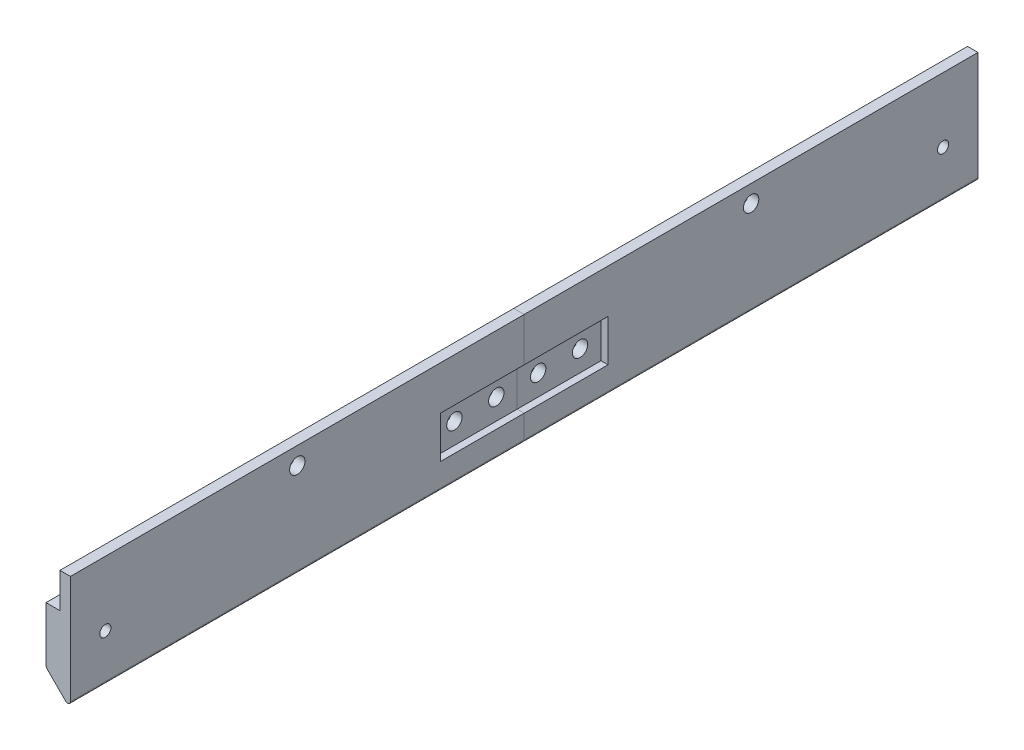
ISO-10303-21;
HEADER;
FILE_DESCRIPTION(('STEP AP214'),'2;1');
FILE_NAME('part.step','',(''),(''),'','','');
FILE_SCHEMA(('AUTOMOTIVE_DESIGN { 1 0 10303 214 1 1 1 1 }'));
ENDSEC;
DATA;
#1=APPLICATION_CONTEXT('core data for automotive mechanical design processes');
#2=APPLICATION_PROTOCOL_DEFINITION('international standard','automotive_design',2000,#1);
#3=PRODUCT_CONTEXT('',#1,'mechanical');
#4=PRODUCT('Part','Part','',(#3));
#5=PRODUCT_RELATED_PRODUCT_CATEGORY('part','',(#4));
#6=PRODUCT_DEFINITION_FORMATION('','',#4);
#7=PRODUCT_DEFINITION_CONTEXT('part definition',#1,'design');
#8=PRODUCT_DEFINITION('design','',#6,#7);
#9=PRODUCT_DEFINITION_SHAPE('','',#8);
#10=(LENGTH_UNIT() NAMED_UNIT(*) SI_UNIT(.MILLI.,.METRE.));
#11=(NAMED_UNIT(*) PLANE_ANGLE_UNIT() SI_UNIT($,.RADIAN.));
#12=(NAMED_UNIT(*) SI_UNIT($,.STERADIAN.) SOLID_ANGLE_UNIT());
#13=UNCERTAINTY_MEASURE_WITH_UNIT(LENGTH_MEASURE(1.E-05),#10,'distance_accuracy_value','');
#14=(GEOMETRIC_REPRESENTATION_CONTEXT(3) GLOBAL_UNCERTAINTY_ASSIGNED_CONTEXT((#13)) GLOBAL_UNIT_ASSIGNED_CONTEXT((#10,
#11,#12)) REPRESENTATION_CONTEXT('',''));
#15=CARTESIAN_POINT('',(0.,0.,0.));
#16=DIRECTION('',(0.,0.,1.));
#17=DIRECTION('',(1.,0.,0.));
#18=AXIS2_PLACEMENT_3D('',#15,#16,#17);
#19=CARTESIAN_POINT('',(-7.01000000000001,30.,150.));
#20=DIRECTION('',(0.,0.,1.));
#21=DIRECTION('',(1.,0.,0.));
#22=AXIS2_PLACEMENT_3D('',#19,#20,#21);
#23=PLANE('',#22);
#24=DIRECTION('',(1.,0.,0.));
#25=VECTOR('',#24,1.);
#26=CARTESIAN_POINT('',(-7.01,5.5,150.));
#27=LINE('',#26,#25);
#28=CARTESIAN_POINT('',(-2.,5.5,150.));
#29=VERTEX_POINT('',#28);
#30=CARTESIAN_POINT('',(0.,5.5,150.));
#31=VERTEX_POINT('',#30);
#32=EDGE_CURVE('E175',#29,#31,#27,.T.);
#33=ORIENTED_EDGE('',*,*,#32,.F.);
#34=DIRECTION('',(0.,1.,0.));
#35=VECTOR('',#34,1.);
#36=CARTESIAN_POINT('',(-2.00000000000001,30.,150.));
#37=LINE('',#36,#35);
#38=CARTESIAN_POINT('',(-2.,17.5,150.));
#39=VERTEX_POINT('',#38);
#40=EDGE_CURVE('E12',#29,#39,#37,.T.);
#41=ORIENTED_EDGE('',*,*,#40,.T.);
#42=DIRECTION('',(-1.,0.,0.));
#43=VECTOR('',#42,1.);
#44=CARTESIAN_POINT('',(-7.01,17.5,150.));
#45=LINE('',#44,#43);
#46=CARTESIAN_POINT('',(0.,17.5,150.));
#47=VERTEX_POINT('',#46);
#48=EDGE_CURVE('E158',#47,#39,#45,.T.);
#49=ORIENTED_EDGE('',*,*,#48,.F.);
#50=DIRECTION('',(0.,-1.,0.));
#51=VECTOR('',#50,1.);
#52=CARTESIAN_POINT('',(0.,0.,150.));
#53=LINE('',#52,#51);
#54=CARTESIAN_POINT('',(0.,30.,150.));
#55=VERTEX_POINT('',#54);
#56=EDGE_CURVE('E227',#55,#47,#53,.T.);
#57=ORIENTED_EDGE('',*,*,#56,.F.);
#58=DIRECTION('',(1.,0.,0.));
#59=VECTOR('',#58,1.);
#60=CARTESIAN_POINT('',(0.,30.,150.));
#61=LINE('',#60,#59);
#62=CARTESIAN_POINT('',(-3.,30.,150.));
#63=VERTEX_POINT('',#62);
#64=EDGE_CURVE('E218',#63,#55,#61,.T.);
#65=ORIENTED_EDGE('',*,*,#64,.F.);
#66=DIRECTION('',(0.,1.,0.));
#67=VECTOR('',#66,1.);
#68=CARTESIAN_POINT('',(-3.,20.,150.));
#69=LINE('',#68,#67);
#70=CARTESIAN_POINT('',(-3.,20.,150.));
#71=VERTEX_POINT('',#70);
#72=EDGE_CURVE('E234',#71,#63,#69,.T.);
#73=ORIENTED_EDGE('',*,*,#72,.F.);
#74=DIRECTION('',(-1.,0.,0.));
#75=VECTOR('',#74,1.);
#76=CARTESIAN_POINT('',(-7.,20.,150.));
#77=LINE('',#76,#75);
#78=CARTESIAN_POINT('',(-7.,20.,150.));
#79=VERTEX_POINT('',#78);
#80=EDGE_CURVE('E237',#71,#79,#77,.T.);
#81=ORIENTED_EDGE('',*,*,#80,.T.);
#82=DIRECTION('',(0.,1.,0.));
#83=VECTOR('',#82,1.);
#84=CARTESIAN_POINT('',(-7.,7.,150.));
#85=LINE('',#84,#83);
#86=CARTESIAN_POINT('',(-7.,4.62132034355964,150.));
#87=VERTEX_POINT('',#86);
#88=EDGE_CURVE('E231',#87,#79,#85,.T.);
#89=ORIENTED_EDGE('',*,*,#88,.F.);
#90=CARTESIAN_POINT('',(-5.5,4.62132034355964,150.));
#91=DIRECTION('',(0.,0.,1.));
#92=DIRECTION('',(1.,0.,0.));
#93=AXIS2_PLACEMENT_3D('',#90,#91,#92);
#94=CIRCLE('',#93,1.5);
#95=CARTESIAN_POINT('',(-6.56066017177982,3.56066017177982,150.));
#96=VERTEX_POINT('',#95);
#97=EDGE_CURVE('E222',#96,#87,#94,.F.);
#98=ORIENTED_EDGE('',*,*,#97,.F.);
#99=DIRECTION('',(-0.707106781186548,0.707106781186548,0.));
#100=VECTOR('',#99,1.);
#101=CARTESIAN_POINT('',(-7.,4.,150.));
#102=LINE('',#101,#100);
#103=CARTESIAN_POINT('',(-1.36568542494924,-1.63431457505076,150.));
#104=VERTEX_POINT('',#103);
#105=EDGE_CURVE('E224',#104,#96,#102,.T.);
#106=ORIENTED_EDGE('',*,*,#105,.F.);
#107=CARTESIAN_POINT('',(-0.8,-1.06862915010153,150.));
#108=DIRECTION('',(0.,0.,1.));
#109=DIRECTION('',(1.,0.,0.));
#110=AXIS2_PLACEMENT_3D('',#107,#108,#109);
#111=CIRCLE('',#110,0.8);
#112=CARTESIAN_POINT('',(0.,-1.06862915010152,150.));
#113=VERTEX_POINT('',#112);
#114=EDGE_CURVE('E220',#113,#104,#111,.F.);
#115=ORIENTED_EDGE('',*,*,#114,.F.);
#116=EDGE_CURVE('E230',#31,#113,#53,.T.);
#117=ORIENTED_EDGE('',*,*,#116,.F.);
#118=EDGE_LOOP('',(#33,#41,#49,#57,#65,#73,#81,#89,#98,#106,#115,#117));
#119=FACE_BOUND('',#118,.T.);
#120=ADVANCED_FACE('F55',(#119),#23,.T.);
#121=CARTESIAN_POINT('',(-3.,20.,20.));
#122=DIRECTION('',(-1.,0.,0.));
#123=DIRECTION('',(0.,0.,1.));
#124=AXIS2_PLACEMENT_3D('',#121,#122,#123);
#125=PLANE('',#124);
#126=CARTESIAN_POINT('',(-3.,25.,85.));
#127=DIRECTION('',(-1.,0.,0.));
#128=DIRECTION('',(0.,0.,1.));
#129=AXIS2_PLACEMENT_3D('',#126,#127,#128);
#130=CIRCLE('',#129,2.2);
#131=CARTESIAN_POINT('',(-3.,25.,87.2));
#132=VERTEX_POINT('',#131);
#133=EDGE_CURVE('E177',#132,#132,#130,.T.);
#134=ORIENTED_EDGE('',*,*,#133,.F.);
#135=EDGE_LOOP('',(#134));
#136=FACE_BOUND('',#135,.T.);
#137=DIRECTION('',(0.,0.,-1.));
#138=VECTOR('',#137,1.);
#139=CARTESIAN_POINT('',(-3.,20.,280.));
#140=LINE('',#139,#138);
#141=CARTESIAN_POINT('',(-3.,20.,20.));
#142=VERTEX_POINT('',#141);
#143=EDGE_CURVE('E79',#71,#142,#140,.T.);
#144=ORIENTED_EDGE('',*,*,#143,.F.);
#145=ORIENTED_EDGE('',*,*,#72,.T.);
#146=DIRECTION('',(0.,0.,1.));
#147=VECTOR('',#146,1.);
#148=CARTESIAN_POINT('',(-3.,30.,20.));
#149=LINE('',#148,#147);
#150=CARTESIAN_POINT('',(-3.,30.,20.));
#151=VERTEX_POINT('',#150);
#152=EDGE_CURVE('E208',#151,#63,#149,.T.);
#153=ORIENTED_EDGE('',*,*,#152,.F.);
#154=DIRECTION('',(0.,-1.,0.));
#155=VECTOR('',#154,1.);
#156=CARTESIAN_POINT('',(-3.,20.,20.));
#157=LINE('',#156,#155);
#158=EDGE_CURVE('E188',#151,#142,#157,.T.);
#159=ORIENTED_EDGE('',*,*,#158,.T.);
#160=EDGE_LOOP('',(#144,#145,#153,#159));
#161=FACE_BOUND('',#160,.T.);
#162=ADVANCED_FACE('F280',(#136,#161),#125,.T.);
#163=CARTESIAN_POINT('',(-7.,7.,20.));
#164=DIRECTION('',(-1.,0.,0.));
#165=DIRECTION('',(0.,0.,1.));
#166=AXIS2_PLACEMENT_3D('',#163,#164,#165);
#167=PLANE('',#166);
#168=CARTESIAN_POINT('',(-7.,11.5,30.));
#169=DIRECTION('',(-1.,0.,0.));
#170=DIRECTION('',(0.,0.,1.));
#171=AXIS2_PLACEMENT_3D('',#168,#169,#170);
#172=CIRCLE('',#171,3.36);
#173=CARTESIAN_POINT('',(-7.,11.5,33.36));
#174=VERTEX_POINT('',#173);
#175=EDGE_CURVE('E215',#174,#174,#172,.T.);
#176=ORIENTED_EDGE('',*,*,#175,.F.);
#177=EDGE_LOOP('',(#176));
#178=FACE_BOUND('',#177,.T.);
#179=DIRECTION('',(0.,0.,1.));
#180=VECTOR('',#179,1.);
#181=CARTESIAN_POINT('',(-7.,4.62132034355964,20.));
#182=LINE('',#181,#180);
#183=CARTESIAN_POINT('',(-7.,4.62132034355964,20.));
#184=VERTEX_POINT('',#183);
#185=EDGE_CURVE('E192',#184,#87,#182,.T.);
#186=ORIENTED_EDGE('',*,*,#185,.T.);
#187=ORIENTED_EDGE('',*,*,#88,.T.);
#188=DIRECTION('',(0.,0.,-1.));
#189=VECTOR('',#188,1.);
#190=CARTESIAN_POINT('',(-7.,20.,280.));
#191=LINE('',#190,#189);
#192=CARTESIAN_POINT('',(-7.,20.,20.));
#193=VERTEX_POINT('',#192);
#194=EDGE_CURVE('E207',#79,#193,#191,.T.);
#195=ORIENTED_EDGE('',*,*,#194,.T.);
#196=DIRECTION('',(0.,-1.,0.));
#197=VECTOR('',#196,1.);
#198=CARTESIAN_POINT('',(-7.,7.,20.));
#199=LINE('',#198,#197);
#200=EDGE_CURVE('E198',#193,#184,#199,.T.);
#201=ORIENTED_EDGE('',*,*,#200,.T.);
#202=EDGE_LOOP('',(#186,#187,#195,#201));
#203=FACE_BOUND('',#202,.T.);
#204=ADVANCED_FACE('F285',(#178,#203),#167,.T.);
#205=CARTESIAN_POINT('',(0.,0.,20.));
#206=DIRECTION('',(1.,0.,0.));
#207=DIRECTION('',(0.,1.,0.));
#208=AXIS2_PLACEMENT_3D('',#205,#206,#207);
#209=PLANE('',#208);
#210=DIRECTION('',(0.,0.,-1.));
#211=VECTOR('',#210,1.);
#212=CARTESIAN_POINT('',(0.,5.5,20.));
#213=LINE('',#212,#211);
#214=CARTESIAN_POINT('',(0.,5.5,126.));
#215=VERTEX_POINT('',#214);
#216=EDGE_CURVE('E63',#31,#215,#213,.T.);
#217=ORIENTED_EDGE('',*,*,#216,.F.);
#218=ORIENTED_EDGE('',*,*,#116,.T.);
#219=DIRECTION('',(0.,0.,-1.));
#220=VECTOR('',#219,1.);
#221=CARTESIAN_POINT('',(0.,-1.06862915010152,20.));
#222=LINE('',#221,#220);
#223=CARTESIAN_POINT('',(0.,-1.06862915010152,20.));
#224=VERTEX_POINT('',#223);
#225=EDGE_CURVE('E183',#113,#224,#222,.T.);
#226=ORIENTED_EDGE('',*,*,#225,.T.);
#227=DIRECTION('',(0.,1.,0.));
#228=VECTOR('',#227,1.);
#229=CARTESIAN_POINT('',(0.,0.,20.));
#230=LINE('',#229,#228);
#231=CARTESIAN_POINT('',(0.,30.,20.));
#232=VERTEX_POINT('',#231);
#233=EDGE_CURVE('E191',#224,#232,#230,.T.);
#234=ORIENTED_EDGE('',*,*,#233,.T.);
#235=DIRECTION('',(0.,0.,-1.));
#236=VECTOR('',#235,1.);
#237=CARTESIAN_POINT('',(0.,30.,280.));
#238=LINE('',#237,#236);
#239=EDGE_CURVE('E204',#55,#232,#238,.T.);
#240=ORIENTED_EDGE('',*,*,#239,.F.);
#241=ORIENTED_EDGE('',*,*,#56,.T.);
#242=DIRECTION('',(0.,0.,1.));
#243=VECTOR('',#242,1.);
#244=CARTESIAN_POINT('',(0.,17.5,174.));
#245=LINE('',#244,#243);
#246=CARTESIAN_POINT('',(0.,17.5,126.));
#247=VERTEX_POINT('',#246);
#248=EDGE_CURVE('E164',#247,#47,#245,.T.);
#249=ORIENTED_EDGE('',*,*,#248,.F.);
#250=DIRECTION('',(0.,1.,0.));
#251=VECTOR('',#250,1.);
#252=CARTESIAN_POINT('',(0.,17.5,126.));
#253=LINE('',#252,#251);
#254=EDGE_CURVE('E70',#215,#247,#253,.T.);
#255=ORIENTED_EDGE('',*,*,#254,.F.);
#256=EDGE_LOOP('',(#217,#218,#226,#234,#240,#241,#249,#255));
#257=FACE_BOUND('',#256,.T.);
#258=CARTESIAN_POINT('',(0.,25.,85.));
#259=DIRECTION('',(1.,0.,0.));
#260=DIRECTION('',(0.,1.,0.));
#261=AXIS2_PLACEMENT_3D('',#258,#259,#260);
#262=CIRCLE('',#261,2.2);
#263=CARTESIAN_POINT('',(0.,27.2,85.));
#264=VERTEX_POINT('',#263);
#265=EDGE_CURVE('E180',#264,#264,#262,.T.);
#266=ORIENTED_EDGE('',*,*,#265,.F.);
#267=EDGE_LOOP('',(#266));
#268=FACE_BOUND('',#267,.T.);
#269=CARTESIAN_POINT('',(0.,11.5,30.));
#270=DIRECTION('',(-1.,0.,0.));
#271=DIRECTION('',(0.,0.,1.));
#272=AXIS2_PLACEMENT_3D('',#269,#270,#271);
#273=CIRCLE('',#272,1.59999999999999);
#274=CARTESIAN_POINT('',(0.,11.5,31.6));
#275=VERTEX_POINT('',#274);
#276=EDGE_CURVE('E209',#275,#275,#273,.T.);
#277=ORIENTED_EDGE('',*,*,#276,.T.);
#278=EDGE_LOOP('',(#277));
#279=FACE_BOUND('',#278,.T.);
#280=ADVANCED_FACE('F258',(#257,#268,#279),#209,.T.);
#281=CARTESIAN_POINT('',(-7.,4.,20.));
#282=DIRECTION('',(-0.707106781186548,-0.707106781186548,0.));
#283=DIRECTION('',(0.707106781186548,-0.707106781186548,0.));
#284=AXIS2_PLACEMENT_3D('',#281,#282,#283);
#285=PLANE('',#284);
#286=DIRECTION('',(0.,0.,-1.));
#287=VECTOR('',#286,1.);
#288=CARTESIAN_POINT('',(-1.36568542494924,-1.63431457505076,20.));
#289=LINE('',#288,#287);
#290=CARTESIAN_POINT('',(-1.36568542494924,-1.63431457505076,20.));
#291=VERTEX_POINT('',#290);
#292=EDGE_CURVE('E184',#291,#104,#289,.F.);
#293=ORIENTED_EDGE('',*,*,#292,.T.);
#294=ORIENTED_EDGE('',*,*,#105,.T.);
#295=DIRECTION('',(0.,0.,1.));
#296=VECTOR('',#295,1.);
#297=CARTESIAN_POINT('',(-6.56066017177982,3.56066017177982,20.));
#298=LINE('',#297,#296);
#299=CARTESIAN_POINT('',(-6.56066017177982,3.56066017177982,20.));
#300=VERTEX_POINT('',#299);
#301=EDGE_CURVE('E187',#96,#300,#298,.F.);
#302=ORIENTED_EDGE('',*,*,#301,.T.);
#303=DIRECTION('',(0.707106781186548,-0.707106781186548,0.));
#304=VECTOR('',#303,1.);
#305=CARTESIAN_POINT('',(-7.,4.,20.));
#306=LINE('',#305,#304);
#307=EDGE_CURVE('E195',#300,#291,#306,.T.);
#308=ORIENTED_EDGE('',*,*,#307,.T.);
#309=EDGE_LOOP('',(#293,#294,#302,#308));
#310=FACE_BOUND('',#309,.T.);
#311=ADVANCED_FACE('F290',(#310),#285,.T.);
#312=CARTESIAN_POINT('',(-5.5,4.62132034355964,20.));
#313=DIRECTION('',(0.,0.,1.));
#314=DIRECTION('',(1.,0.,0.));
#315=AXIS2_PLACEMENT_3D('',#312,#313,#314);
#316=CYLINDRICAL_SURFACE('',#315,1.5);
#317=ORIENTED_EDGE('',*,*,#301,.F.);
#318=ORIENTED_EDGE('',*,*,#97,.T.);
#319=ORIENTED_EDGE('',*,*,#185,.F.);
#320=CARTESIAN_POINT('',(-5.5,4.62132034355964,20.));
#321=DIRECTION('',(0.,0.,1.));
#322=DIRECTION('',(1.,0.,0.));
#323=AXIS2_PLACEMENT_3D('',#320,#321,#322);
#324=CIRCLE('',#323,1.5);
#325=EDGE_CURVE('E185',#300,#184,#324,.F.);
#326=ORIENTED_EDGE('',*,*,#325,.F.);
#327=EDGE_LOOP('',(#317,#318,#319,#326));
#328=FACE_BOUND('',#327,.T.);
#329=ADVANCED_FACE('F57',(#328),#316,.T.);
#330=CARTESIAN_POINT('',(-0.8,-1.06862915010153,20.));
#331=DIRECTION('',(0.,0.,-1.));
#332=DIRECTION('',(-1.,0.,0.));
#333=AXIS2_PLACEMENT_3D('',#330,#331,#332);
#334=CYLINDRICAL_SURFACE('',#333,0.8);
#335=ORIENTED_EDGE('',*,*,#225,.F.);
#336=ORIENTED_EDGE('',*,*,#114,.T.);
#337=ORIENTED_EDGE('',*,*,#292,.F.);
#338=CARTESIAN_POINT('',(-0.8,-1.06862915010153,20.));
#339=DIRECTION('',(0.,0.,1.));
#340=DIRECTION('',(1.,0.,0.));
#341=AXIS2_PLACEMENT_3D('',#338,#339,#340);
#342=CIRCLE('',#341,0.8);
#343=EDGE_CURVE('E181',#224,#291,#342,.F.);
#344=ORIENTED_EDGE('',*,*,#343,.F.);
#345=EDGE_LOOP('',(#335,#336,#337,#344));
#346=FACE_BOUND('',#345,.T.);
#347=ADVANCED_FACE('F271',(#346),#334,.T.);
#348=CARTESIAN_POINT('',(0.,30.,0.));
#349=DIRECTION('',(0.,1.,0.));
#350=DIRECTION('',(0.,0.,1.));
#351=AXIS2_PLACEMENT_3D('',#348,#349,#350);
#352=PLANE('',#351);
#353=ORIENTED_EDGE('',*,*,#152,.T.);
#354=ORIENTED_EDGE('',*,*,#64,.T.);
#355=ORIENTED_EDGE('',*,*,#239,.T.);
#356=DIRECTION('',(-1.,0.,0.));
#357=VECTOR('',#356,1.);
#358=CARTESIAN_POINT('',(0.,30.,20.));
#359=LINE('',#358,#357);
#360=EDGE_CURVE('E201',#232,#151,#359,.T.);
#361=ORIENTED_EDGE('',*,*,#360,.T.);
#362=EDGE_LOOP('',(#353,#354,#355,#361));
#363=FACE_BOUND('',#362,.T.);
#364=ADVANCED_FACE('F278',(#363),#352,.T.);
#365=CARTESIAN_POINT('',(-7.,20.,280.));
#366=DIRECTION('',(0.,-1.,0.));
#367=DIRECTION('',(0.,0.,-1.));
#368=AXIS2_PLACEMENT_3D('',#365,#366,#367);
#369=PLANE('',#368);
#370=ORIENTED_EDGE('',*,*,#80,.F.);
#371=ORIENTED_EDGE('',*,*,#143,.T.);
#372=DIRECTION('',(1.,0.,0.));
#373=VECTOR('',#372,1.);
#374=CARTESIAN_POINT('',(-7.,20.,20.));
#375=LINE('',#374,#373);
#376=EDGE_CURVE('E205',#193,#142,#375,.T.);
#377=ORIENTED_EDGE('',*,*,#376,.F.);
#378=ORIENTED_EDGE('',*,*,#194,.F.);
#379=EDGE_LOOP('',(#370,#371,#377,#378));
#380=FACE_BOUND('',#379,.T.);
#381=ADVANCED_FACE('F283',(#380),#369,.F.);
#382=CARTESIAN_POINT('',(0.,0.,20.));
#383=DIRECTION('',(0.,0.,1.));
#384=DIRECTION('',(1.,0.,0.));
#385=AXIS2_PLACEMENT_3D('',#382,#383,#384);
#386=PLANE('',#385);
#387=ORIENTED_EDGE('',*,*,#200,.F.);
#388=ORIENTED_EDGE('',*,*,#376,.T.);
#389=ORIENTED_EDGE('',*,*,#158,.F.);
#390=ORIENTED_EDGE('',*,*,#360,.F.);
#391=ORIENTED_EDGE('',*,*,#233,.F.);
#392=ORIENTED_EDGE('',*,*,#343,.T.);
#393=ORIENTED_EDGE('',*,*,#307,.F.);
#394=ORIENTED_EDGE('',*,*,#325,.T.);
#395=EDGE_LOOP('',(#387,#388,#389,#390,#391,#392,#393,#394));
#396=FACE_BOUND('',#395,.T.);
#397=ADVANCED_FACE('F275',(#396),#386,.F.);
#398=CARTESIAN_POINT('',(-7.,11.5,30.));
#399=DIRECTION('',(-1.,0.,0.));
#400=DIRECTION('',(0.,0.,1.));
#401=AXIS2_PLACEMENT_3D('',#398,#399,#400);
#402=CYLINDRICAL_SURFACE('',#401,1.59999999999999);
#403=ORIENTED_EDGE('',*,*,#276,.F.);
#404=EDGE_LOOP('',(#403));
#405=FACE_BOUND('',#404,.T.);
#406=CARTESIAN_POINT('',(-5.23999999999999,11.5,30.));
#407=DIRECTION('',(-1.,0.,0.));
#408=DIRECTION('',(0.,0.,1.));
#409=AXIS2_PLACEMENT_3D('',#406,#407,#408);
#410=CIRCLE('',#409,1.59999999999999);
#411=CARTESIAN_POINT('',(-5.23999999999999,11.5,31.6));
#412=VERTEX_POINT('',#411);
#413=EDGE_CURVE('E212',#412,#412,#410,.T.);
#414=ORIENTED_EDGE('',*,*,#413,.T.);
#415=EDGE_LOOP('',(#414));
#416=FACE_BOUND('',#415,.T.);
#417=ADVANCED_FACE('F333',(#405,#416),#402,.F.);
#418=CARTESIAN_POINT('',(-7.,11.5,30.));
#419=DIRECTION('',(-1.,0.,0.));
#420=DIRECTION('',(0.,0.,1.));
#421=AXIS2_PLACEMENT_3D('',#418,#419,#420);
#422=CONICAL_SURFACE('',#421,3.36,0.785398163397448);
#423=ORIENTED_EDGE('',*,*,#413,.F.);
#424=EDGE_LOOP('',(#423));
#425=FACE_BOUND('',#424,.T.);
#426=ORIENTED_EDGE('',*,*,#175,.T.);
#427=EDGE_LOOP('',(#426));
#428=FACE_BOUND('',#427,.T.);
#429=ADVANCED_FACE('F309',(#425,#428),#422,.F.);
#430=CARTESIAN_POINT('',(-3.,25.,85.));
#431=DIRECTION('',(-1.,0.,0.));
#432=DIRECTION('',(0.,0.,1.));
#433=AXIS2_PLACEMENT_3D('',#430,#431,#432);
#434=CYLINDRICAL_SURFACE('',#433,2.2);
#435=ORIENTED_EDGE('',*,*,#265,.T.);
#436=EDGE_LOOP('',(#435));
#437=FACE_BOUND('',#436,.T.);
#438=ORIENTED_EDGE('',*,*,#133,.T.);
#439=EDGE_LOOP('',(#438));
#440=FACE_BOUND('',#439,.T.);
#441=ADVANCED_FACE('F308',(#437,#440),#434,.F.);
#442=CARTESIAN_POINT('',(-2.,17.5,126.));
#443=DIRECTION('',(0.,0.,-1.));
#444=DIRECTION('',(-1.,0.,0.));
#445=AXIS2_PLACEMENT_3D('',#442,#443,#444);
#446=PLANE('',#445);
#447=ORIENTED_EDGE('',*,*,#254,.T.);
#448=DIRECTION('',(1.,0.,0.));
#449=VECTOR('',#448,1.);
#450=CARTESIAN_POINT('',(-2.,17.5,126.));
#451=LINE('',#450,#449);
#452=CARTESIAN_POINT('',(-2.,17.5,126.));
#453=VERTEX_POINT('',#452);
#454=EDGE_CURVE('E144',#453,#247,#451,.T.);
#455=ORIENTED_EDGE('',*,*,#454,.F.);
#456=DIRECTION('',(0.,1.,0.));
#457=VECTOR('',#456,1.);
#458=CARTESIAN_POINT('',(-2.,17.5,126.));
#459=LINE('',#458,#457);
#460=CARTESIAN_POINT('',(-2.,5.5,126.));
#461=VERTEX_POINT('',#460);
#462=EDGE_CURVE('E148',#461,#453,#459,.T.);
#463=ORIENTED_EDGE('',*,*,#462,.F.);
#464=DIRECTION('',(1.,0.,0.));
#465=VECTOR('',#464,1.);
#466=CARTESIAN_POINT('',(-2.,5.5,126.));
#467=LINE('',#466,#465);
#468=EDGE_CURVE('E151',#461,#215,#467,.T.);
#469=ORIENTED_EDGE('',*,*,#468,.T.);
#470=EDGE_LOOP('',(#447,#455,#463,#469));
#471=FACE_BOUND('',#470,.T.);
#472=ADVANCED_FACE('F146',(#471),#446,.F.);
#473=CARTESIAN_POINT('',(-2.,5.5,174.));
#474=DIRECTION('',(0.,-1.,0.));
#475=DIRECTION('',(1.,0.,0.));
#476=AXIS2_PLACEMENT_3D('',#473,#474,#475);
#477=PLANE('',#476);
#478=ORIENTED_EDGE('',*,*,#32,.T.);
#479=ORIENTED_EDGE('',*,*,#216,.T.);
#480=ORIENTED_EDGE('',*,*,#468,.F.);
#481=DIRECTION('',(0.,0.,-1.));
#482=VECTOR('',#481,1.);
#483=CARTESIAN_POINT('',(-2.,5.5,174.));
#484=LINE('',#483,#482);
#485=EDGE_CURVE('E152',#29,#461,#484,.T.);
#486=ORIENTED_EDGE('',*,*,#485,.F.);
#487=EDGE_LOOP('',(#478,#479,#480,#486));
#488=FACE_BOUND('',#487,.T.);
#489=ADVANCED_FACE('F254',(#488),#477,.F.);
#490=CARTESIAN_POINT('',(-2.,17.5,174.));
#491=DIRECTION('',(0.,1.,0.));
#492=DIRECTION('',(-1.,0.,0.));
#493=AXIS2_PLACEMENT_3D('',#490,#491,#492);
#494=PLANE('',#493);
#495=ORIENTED_EDGE('',*,*,#48,.T.);
#496=DIRECTION('',(0.,0.,1.));
#497=VECTOR('',#496,1.);
#498=CARTESIAN_POINT('',(-2.,17.5,174.));
#499=LINE('',#498,#497);
#500=EDGE_CURVE('E155',#453,#39,#499,.T.);
#501=ORIENTED_EDGE('',*,*,#500,.F.);
#502=ORIENTED_EDGE('',*,*,#454,.T.);
#503=ORIENTED_EDGE('',*,*,#248,.T.);
#504=EDGE_LOOP('',(#495,#501,#502,#503));
#505=FACE_BOUND('',#504,.T.);
#506=ADVANCED_FACE('F156',(#505),#494,.F.);
#507=CARTESIAN_POINT('',(-2.,0.,0.));
#508=DIRECTION('',(1.,0.,0.));
#509=DIRECTION('',(0.,1.,0.));
#510=AXIS2_PLACEMENT_3D('',#507,#508,#509);
#511=PLANE('',#510);
#512=CARTESIAN_POINT('',(-2.,11.5,144.));
#513=DIRECTION('',(1.,0.,0.));
#514=DIRECTION('',(0.,0.,-1.));
#515=AXIS2_PLACEMENT_3D('',#512,#513,#514);
#516=CIRCLE('',#515,2.2);
#517=CARTESIAN_POINT('',(-2.,11.5,141.8));
#518=VERTEX_POINT('',#517);
#519=EDGE_CURVE('E457',#518,#518,#516,.T.);
#520=ORIENTED_EDGE('',*,*,#519,.F.);
#521=EDGE_LOOP('',(#520));
#522=FACE_BOUND('',#521,.T.);
#523=CARTESIAN_POINT('',(-2.,11.5,132.));
#524=DIRECTION('',(1.,0.,0.));
#525=DIRECTION('',(0.,0.,-1.));
#526=AXIS2_PLACEMENT_3D('',#523,#524,#525);
#527=CIRCLE('',#526,2.2);
#528=CARTESIAN_POINT('',(-2.,11.5,129.8));
#529=VERTEX_POINT('',#528);
#530=EDGE_CURVE('E459',#529,#529,#527,.T.);
#531=ORIENTED_EDGE('',*,*,#530,.F.);
#532=EDGE_LOOP('',(#531));
#533=FACE_BOUND('',#532,.T.);
#534=ORIENTED_EDGE('',*,*,#485,.T.);
#535=ORIENTED_EDGE('',*,*,#462,.T.);
#536=ORIENTED_EDGE('',*,*,#500,.T.);
#537=ORIENTED_EDGE('',*,*,#40,.F.);
#538=EDGE_LOOP('',(#534,#535,#536,#537));
#539=FACE_BOUND('',#538,.T.);
#540=ADVANCED_FACE('F161',(#522,#533,#539),#511,.T.);
#541=CARTESIAN_POINT('',(-5.,11.5,132.));
#542=DIRECTION('',(-1.,0.,0.));
#543=DIRECTION('',(0.,0.,1.));
#544=AXIS2_PLACEMENT_3D('',#541,#542,#543);
#545=PLANE('',#544);
#546=CARTESIAN_POINT('',(-5.,11.5,132.));
#547=DIRECTION('',(1.,0.,0.));
#548=DIRECTION('',(0.,0.,-1.));
#549=AXIS2_PLACEMENT_3D('',#546,#547,#548);
#550=CIRCLE('',#549,2.2);
#551=CARTESIAN_POINT('',(-5.,11.5,129.8));
#552=VERTEX_POINT('',#551);
#553=EDGE_CURVE('E168',#552,#552,#550,.T.);
#554=ORIENTED_EDGE('',*,*,#553,.T.);
#555=EDGE_LOOP('',(#554));
#556=FACE_BOUND('',#555,.T.);
#557=ADVANCED_FACE('F402',(#556),#545,.F.);
#558=CARTESIAN_POINT('',(-2.,11.5,132.));
#559=DIRECTION('',(1.,0.,0.));
#560=DIRECTION('',(0.,0.,-1.));
#561=AXIS2_PLACEMENT_3D('',#558,#559,#560);
#562=CYLINDRICAL_SURFACE('',#561,2.2);
#563=ORIENTED_EDGE('',*,*,#553,.F.);
#564=EDGE_LOOP('',(#563));
#565=FACE_BOUND('',#564,.T.);
#566=ORIENTED_EDGE('',*,*,#530,.T.);
#567=EDGE_LOOP('',(#566));
#568=FACE_BOUND('',#567,.T.);
#569=ADVANCED_FACE('F411',(#565,#568),#562,.F.);
#570=CARTESIAN_POINT('',(-5.,11.5,144.));
#571=DIRECTION('',(-1.,0.,0.));
#572=DIRECTION('',(0.,0.,1.));
#573=AXIS2_PLACEMENT_3D('',#570,#571,#572);
#574=PLANE('',#573);
#575=CARTESIAN_POINT('',(-5.,11.5,144.));
#576=DIRECTION('',(1.,0.,0.));
#577=DIRECTION('',(0.,0.,-1.));
#578=AXIS2_PLACEMENT_3D('',#575,#576,#577);
#579=CIRCLE('',#578,2.2);
#580=CARTESIAN_POINT('',(-5.,11.5,141.8));
#581=VERTEX_POINT('',#580);
#582=EDGE_CURVE('E454',#581,#581,#579,.T.);
#583=ORIENTED_EDGE('',*,*,#582,.T.);
#584=EDGE_LOOP('',(#583));
#585=FACE_BOUND('',#584,.T.);
#586=ADVANCED_FACE('F420',(#585),#574,.F.);
#587=CARTESIAN_POINT('',(-2.,11.5,144.));
#588=DIRECTION('',(1.,0.,0.));
#589=DIRECTION('',(0.,0.,-1.));
#590=AXIS2_PLACEMENT_3D('',#587,#588,#589);
#591=CYLINDRICAL_SURFACE('',#590,2.2);
#592=ORIENTED_EDGE('',*,*,#582,.F.);
#593=EDGE_LOOP('',(#592));
#594=FACE_BOUND('',#593,.T.);
#595=ORIENTED_EDGE('',*,*,#519,.T.);
#596=EDGE_LOOP('',(#595));
#597=FACE_BOUND('',#596,.T.);
#598=ADVANCED_FACE('F429',(#594,#597),#591,.F.);
#599=CLOSED_SHELL('',(#120,#162,#204,#280,#311,#329,#347,#364,#381,#397,#417,#429,#441,#472,
#489,#506,#540,#557,#569,#586,#598));
#600=MANIFOLD_SOLID_BREP('B2',#599);
#601=CARTESIAN_POINT('',(-7.01000000000001,30.,150.));
#602=DIRECTION('',(0.,0.,1.));
#603=DIRECTION('',(1.,0.,0.));
#604=AXIS2_PLACEMENT_3D('',#601,#602,#603);
#605=PLANE('',#604);
#606=DIRECTION('',(0.,1.,0.));
#607=VECTOR('',#606,1.);
#608=CARTESIAN_POINT('',(-2.00000000000001,30.,150.));
#609=LINE('',#608,#607);
#610=CARTESIAN_POINT('',(-2.,5.5,150.));
#611=VERTEX_POINT('',#610);
#612=CARTESIAN_POINT('',(-2.,17.5,150.));
#613=VERTEX_POINT('',#612);
#614=EDGE_CURVE('E53',#611,#613,#609,.T.);
#615=ORIENTED_EDGE('',*,*,#614,.F.);
#616=DIRECTION('',(1.,0.,0.));
#617=VECTOR('',#616,1.);
#618=CARTESIAN_POINT('',(-7.01,5.5,150.));
#619=LINE('',#618,#617);
#620=CARTESIAN_POINT('',(0.,5.5,150.));
#621=VERTEX_POINT('',#620);
#622=EDGE_CURVE('E659',#611,#621,#619,.T.);
#623=ORIENTED_EDGE('',*,*,#622,.T.);
#624=DIRECTION('',(0.,-1.,0.));
#625=VECTOR('',#624,1.);
#626=CARTESIAN_POINT('',(0.,0.,150.));
#627=LINE('',#626,#625);
#628=CARTESIAN_POINT('',(0.,-1.06862915010152,150.));
#629=VERTEX_POINT('',#628);
#630=EDGE_CURVE('E724',#621,#629,#627,.T.);
#631=ORIENTED_EDGE('',*,*,#630,.T.);
#632=CARTESIAN_POINT('',(-0.8,-1.06862915010153,150.));
#633=DIRECTION('',(0.,0.,1.));
#634=DIRECTION('',(1.,0.,0.));
#635=AXIS2_PLACEMENT_3D('',#632,#633,#634);
#636=CIRCLE('',#635,0.8);
#637=CARTESIAN_POINT('',(-1.36568542494924,-1.63431457505076,150.));
#638=VERTEX_POINT('',#637);
#639=EDGE_CURVE('E719',#629,#638,#636,.F.);
#640=ORIENTED_EDGE('',*,*,#639,.T.);
#641=DIRECTION('',(-0.707106781186548,0.707106781186548,0.));
#642=VECTOR('',#641,1.);
#643=CARTESIAN_POINT('',(-7.,4.,150.));
#644=LINE('',#643,#642);
#645=CARTESIAN_POINT('',(-6.56066017177982,3.56066017177982,150.));
#646=VERTEX_POINT('',#645);
#647=EDGE_CURVE('E723',#638,#646,#644,.T.);
#648=ORIENTED_EDGE('',*,*,#647,.T.);
#649=CARTESIAN_POINT('',(-5.5,4.62132034355964,150.));
#650=DIRECTION('',(0.,0.,1.));
#651=DIRECTION('',(1.,0.,0.));
#652=AXIS2_PLACEMENT_3D('',#649,#650,#651);
#653=CIRCLE('',#652,1.5);
#654=CARTESIAN_POINT('',(-7.,4.62132034355964,150.));
#655=VERTEX_POINT('',#654);
#656=EDGE_CURVE('E729',#646,#655,#653,.F.);
#657=ORIENTED_EDGE('',*,*,#656,.T.);
#658=DIRECTION('',(0.,1.,0.));
#659=VECTOR('',#658,1.);
#660=CARTESIAN_POINT('',(-7.,7.,150.));
#661=LINE('',#660,#659);
#662=CARTESIAN_POINT('',(-7.,20.,150.));
#663=VERTEX_POINT('',#662);
#664=EDGE_CURVE('E725',#655,#663,#661,.T.);
#665=ORIENTED_EDGE('',*,*,#664,.T.);
#666=DIRECTION('',(-1.,0.,0.));
#667=VECTOR('',#666,1.);
#668=CARTESIAN_POINT('',(-7.,20.,150.));
#669=LINE('',#668,#667);
#670=CARTESIAN_POINT('',(-3.,20.,150.));
#671=VERTEX_POINT('',#670);
#672=EDGE_CURVE('E715',#671,#663,#669,.T.);
#673=ORIENTED_EDGE('',*,*,#672,.F.);
#674=DIRECTION('',(0.,1.,0.));
#675=VECTOR('',#674,1.);
#676=CARTESIAN_POINT('',(-3.,20.,150.));
#677=LINE('',#676,#675);
#678=CARTESIAN_POINT('',(-3.,30.,150.));
#679=VERTEX_POINT('',#678);
#680=EDGE_CURVE('E717',#671,#679,#677,.T.);
#681=ORIENTED_EDGE('',*,*,#680,.T.);
#682=DIRECTION('',(1.,0.,0.));
#683=VECTOR('',#682,1.);
#684=CARTESIAN_POINT('',(0.,30.,150.));
#685=LINE('',#684,#683);
#686=CARTESIAN_POINT('',(0.,30.,150.));
#687=VERTEX_POINT('',#686);
#688=EDGE_CURVE('E563',#679,#687,#685,.T.);
#689=ORIENTED_EDGE('',*,*,#688,.T.);
#690=CARTESIAN_POINT('',(0.,17.5,150.));
#691=VERTEX_POINT('',#690);
#692=EDGE_CURVE('E720',#687,#691,#627,.T.);
#693=ORIENTED_EDGE('',*,*,#692,.T.);
#694=DIRECTION('',(-1.,0.,0.));
#695=VECTOR('',#694,1.);
#696=CARTESIAN_POINT('',(-7.01,17.5,150.));
#697=LINE('',#696,#695);
#698=EDGE_CURVE('E555',#691,#613,#697,.T.);
#699=ORIENTED_EDGE('',*,*,#698,.T.);
#700=EDGE_LOOP('',(#615,#623,#631,#640,#648,#657,#665,#673,#681,#689,#693,#699));
#701=FACE_BOUND('',#700,.T.);
#702=ADVANCED_FACE('F541',(#701),#605,.F.);
#703=CARTESIAN_POINT('',(-7.,11.5,270.));
#704=DIRECTION('',(-1.,0.,0.));
#705=DIRECTION('',(0.,0.,1.));
#706=AXIS2_PLACEMENT_3D('',#703,#704,#705);
#707=CONICAL_SURFACE('',#706,3.36,0.785398163397448);
#708=CARTESIAN_POINT('',(-5.23999999999999,11.5,270.));
#709=DIRECTION('',(-1.,0.,0.));
#710=DIRECTION('',(0.,0.,1.));
#711=AXIS2_PLACEMENT_3D('',#708,#709,#710);
#712=CIRCLE('',#711,1.59999999999999);
#713=CARTESIAN_POINT('',(-5.23999999999999,11.5,271.6));
#714=VERTEX_POINT('',#713);
#715=EDGE_CURVE('E669',#714,#714,#712,.T.);
#716=ORIENTED_EDGE('',*,*,#715,.F.);
#717=EDGE_LOOP('',(#716));
#718=FACE_BOUND('',#717,.T.);
#719=CARTESIAN_POINT('',(-7.,11.5,270.));
#720=DIRECTION('',(-1.,0.,0.));
#721=DIRECTION('',(0.,0.,1.));
#722=AXIS2_PLACEMENT_3D('',#719,#720,#721);
#723=CIRCLE('',#722,3.36);
#724=CARTESIAN_POINT('',(-7.,11.5,273.36));
#725=VERTEX_POINT('',#724);
#726=EDGE_CURVE('E666',#725,#725,#723,.T.);
#727=ORIENTED_EDGE('',*,*,#726,.T.);
#728=EDGE_LOOP('',(#727));
#729=FACE_BOUND('',#728,.T.);
#730=ADVANCED_FACE('F754',(#718,#729),#707,.F.);
#731=CARTESIAN_POINT('',(-7.,11.5,270.));
#732=DIRECTION('',(-1.,0.,0.));
#733=DIRECTION('',(0.,0.,1.));
#734=AXIS2_PLACEMENT_3D('',#731,#732,#733);
#735=CYLINDRICAL_SURFACE('',#734,1.59999999999999);
#736=CARTESIAN_POINT('',(0.,11.5,270.));
#737=DIRECTION('',(-1.,0.,0.));
#738=DIRECTION('',(0.,0.,1.));
#739=AXIS2_PLACEMENT_3D('',#736,#737,#738);
#740=CIRCLE('',#739,1.59999999999999);
#741=CARTESIAN_POINT('',(0.,11.5,271.6));
#742=VERTEX_POINT('',#741);
#743=EDGE_CURVE('E672',#742,#742,#740,.T.);
#744=ORIENTED_EDGE('',*,*,#743,.F.);
#745=EDGE_LOOP('',(#744));
#746=FACE_BOUND('',#745,.T.);
#747=ORIENTED_EDGE('',*,*,#715,.T.);
#748=EDGE_LOOP('',(#747));
#749=FACE_BOUND('',#748,.T.);
#750=ADVANCED_FACE('F751',(#746,#749),#735,.F.);
#751=CARTESIAN_POINT('',(-7.,4.,20.));
#752=DIRECTION('',(-0.707106781186548,-0.707106781186548,0.));
#753=DIRECTION('',(0.707106781186548,-0.707106781186548,0.));
#754=AXIS2_PLACEMENT_3D('',#751,#752,#753);
#755=PLANE('',#754);
#756=ORIENTED_EDGE('',*,*,#647,.F.);
#757=DIRECTION('',(0.,0.,-1.));
#758=VECTOR('',#757,1.);
#759=CARTESIAN_POINT('',(-1.36568542494924,-1.63431457505076,20.));
#760=LINE('',#759,#758);
#761=CARTESIAN_POINT('',(-1.36568542494924,-1.63431457505076,280.));
#762=VERTEX_POINT('',#761);
#763=EDGE_CURVE('E711',#638,#762,#760,.F.);
#764=ORIENTED_EDGE('',*,*,#763,.T.);
#765=DIRECTION('',(0.707106781186548,-0.707106781186548,0.));
#766=VECTOR('',#765,1.);
#767=CARTESIAN_POINT('',(-7.,4.,280.));
#768=LINE('',#767,#766);
#769=CARTESIAN_POINT('',(-6.56066017177982,3.56066017177982,280.));
#770=VERTEX_POINT('',#769);
#771=EDGE_CURVE('E693',#770,#762,#768,.T.);
#772=ORIENTED_EDGE('',*,*,#771,.F.);
#773=DIRECTION('',(0.,0.,1.));
#774=VECTOR('',#773,1.);
#775=CARTESIAN_POINT('',(-6.56066017177982,3.56066017177982,20.));
#776=LINE('',#775,#774);
#777=EDGE_CURVE('E705',#770,#646,#776,.F.);
#778=ORIENTED_EDGE('',*,*,#777,.T.);
#779=EDGE_LOOP('',(#756,#764,#772,#778));
#780=FACE_BOUND('',#779,.T.);
#781=ADVANCED_FACE('F746',(#780),#755,.T.);
#782=CARTESIAN_POINT('',(0.,0.,20.));
#783=DIRECTION('',(1.,0.,0.));
#784=DIRECTION('',(0.,1.,0.));
#785=AXIS2_PLACEMENT_3D('',#782,#783,#784);
#786=PLANE('',#785);
#787=DIRECTION('',(0.,0.,-1.));
#788=VECTOR('',#787,1.);
#789=CARTESIAN_POINT('',(0.,5.5,174.));
#790=LINE('',#789,#788);
#791=CARTESIAN_POINT('',(0.,5.5,174.));
#792=VERTEX_POINT('',#791);
#793=EDGE_CURVE('E637',#792,#621,#790,.T.);
#794=ORIENTED_EDGE('',*,*,#793,.F.);
#795=DIRECTION('',(0.,-1.,0.));
#796=VECTOR('',#795,1.);
#797=CARTESIAN_POINT('',(0.,17.5,174.));
#798=LINE('',#797,#796);
#799=CARTESIAN_POINT('',(0.,17.5,174.));
#800=VERTEX_POINT('',#799);
#801=EDGE_CURVE('E653',#800,#792,#798,.T.);
#802=ORIENTED_EDGE('',*,*,#801,.F.);
#803=DIRECTION('',(0.,0.,1.));
#804=VECTOR('',#803,1.);
#805=CARTESIAN_POINT('',(0.,17.5,20.));
#806=LINE('',#805,#804);
#807=EDGE_CURVE('E548',#691,#800,#806,.T.);
#808=ORIENTED_EDGE('',*,*,#807,.F.);
#809=ORIENTED_EDGE('',*,*,#692,.F.);
#810=DIRECTION('',(0.,0.,-1.));
#811=VECTOR('',#810,1.);
#812=CARTESIAN_POINT('',(0.,30.,280.));
#813=LINE('',#812,#811);
#814=CARTESIAN_POINT('',(0.,30.,280.));
#815=VERTEX_POINT('',#814);
#816=EDGE_CURVE('E688',#815,#687,#813,.T.);
#817=ORIENTED_EDGE('',*,*,#816,.F.);
#818=DIRECTION('',(0.,1.,0.));
#819=VECTOR('',#818,1.);
#820=CARTESIAN_POINT('',(0.,0.,280.));
#821=LINE('',#820,#819);
#822=CARTESIAN_POINT('',(0.,-1.06862915010152,280.));
#823=VERTEX_POINT('',#822);
#824=EDGE_CURVE('E696',#823,#815,#821,.T.);
#825=ORIENTED_EDGE('',*,*,#824,.F.);
#826=DIRECTION('',(0.,0.,-1.));
#827=VECTOR('',#826,1.);
#828=CARTESIAN_POINT('',(0.,-1.06862915010152,20.));
#829=LINE('',#828,#827);
#830=EDGE_CURVE('E708',#823,#629,#829,.T.);
#831=ORIENTED_EDGE('',*,*,#830,.T.);
#832=ORIENTED_EDGE('',*,*,#630,.F.);
#833=EDGE_LOOP('',(#794,#802,#808,#809,#817,#825,#831,#832));
#834=FACE_BOUND('',#833,.T.);
#835=CARTESIAN_POINT('',(0.,25.,215.));
#836=DIRECTION('',(1.,0.,0.));
#837=DIRECTION('',(0.,1.,0.));
#838=AXIS2_PLACEMENT_3D('',#835,#836,#837);
#839=CIRCLE('',#838,2.2);
#840=CARTESIAN_POINT('',(0.,27.2,215.));
#841=VERTEX_POINT('',#840);
#842=EDGE_CURVE('E665',#841,#841,#839,.T.);
#843=ORIENTED_EDGE('',*,*,#842,.F.);
#844=EDGE_LOOP('',(#843));
#845=FACE_BOUND('',#844,.T.);
#846=ORIENTED_EDGE('',*,*,#743,.T.);
#847=EDGE_LOOP('',(#846));
#848=FACE_BOUND('',#847,.T.);
#849=ADVANCED_FACE('F742',(#834,#845,#848),#786,.T.);
#850=CARTESIAN_POINT('',(0.,0.,280.));
#851=DIRECTION('',(0.,0.,1.));
#852=DIRECTION('',(1.,0.,0.));
#853=AXIS2_PLACEMENT_3D('',#850,#851,#852);
#854=PLANE('',#853);
#855=DIRECTION('',(1.,0.,0.));
#856=VECTOR('',#855,1.);
#857=CARTESIAN_POINT('',(-7.,20.,280.));
#858=LINE('',#857,#856);
#859=CARTESIAN_POINT('',(-7.,20.,280.));
#860=VERTEX_POINT('',#859);
#861=CARTESIAN_POINT('',(-3.,20.,280.));
#862=VERTEX_POINT('',#861);
#863=EDGE_CURVE('E679',#860,#862,#858,.T.);
#864=ORIENTED_EDGE('',*,*,#863,.F.);
#865=DIRECTION('',(0.,-1.,0.));
#866=VECTOR('',#865,1.);
#867=CARTESIAN_POINT('',(-7.,7.,280.));
#868=LINE('',#867,#866);
#869=CARTESIAN_POINT('',(-7.,4.62132034355964,280.));
#870=VERTEX_POINT('',#869);
#871=EDGE_CURVE('E690',#860,#870,#868,.T.);
#872=ORIENTED_EDGE('',*,*,#871,.T.);
#873=CARTESIAN_POINT('',(-5.5,4.62132034355964,280.));
#874=DIRECTION('',(0.,0.,1.));
#875=DIRECTION('',(1.,0.,0.));
#876=AXIS2_PLACEMENT_3D('',#873,#874,#875);
#877=CIRCLE('',#876,1.5);
#878=EDGE_CURVE('E703',#870,#770,#877,.T.);
#879=ORIENTED_EDGE('',*,*,#878,.T.);
#880=ORIENTED_EDGE('',*,*,#771,.T.);
#881=CARTESIAN_POINT('',(-0.8,-1.06862915010153,280.));
#882=DIRECTION('',(0.,0.,1.));
#883=DIRECTION('',(1.,0.,0.));
#884=AXIS2_PLACEMENT_3D('',#881,#882,#883);
#885=CIRCLE('',#884,0.8);
#886=EDGE_CURVE('E713',#762,#823,#885,.T.);
#887=ORIENTED_EDGE('',*,*,#886,.T.);
#888=ORIENTED_EDGE('',*,*,#824,.T.);
#889=DIRECTION('',(1.,0.,0.));
#890=VECTOR('',#889,1.);
#891=CARTESIAN_POINT('',(-3.,30.,280.));
#892=LINE('',#891,#890);
#893=CARTESIAN_POINT('',(-3.,30.,280.));
#894=VERTEX_POINT('',#893);
#895=EDGE_CURVE('E685',#894,#815,#892,.T.);
#896=ORIENTED_EDGE('',*,*,#895,.F.);
#897=DIRECTION('',(0.,-1.,0.));
#898=VECTOR('',#897,1.);
#899=CARTESIAN_POINT('',(-3.,20.,280.));
#900=LINE('',#899,#898);
#901=EDGE_CURVE('E698',#894,#862,#900,.T.);
#902=ORIENTED_EDGE('',*,*,#901,.T.);
#903=EDGE_LOOP('',(#864,#872,#879,#880,#887,#888,#896,#902));
#904=FACE_BOUND('',#903,.T.);
#905=ADVANCED_FACE('F745',(#904),#854,.T.);
#906=CARTESIAN_POINT('',(-7.,7.,20.));
#907=DIRECTION('',(-1.,0.,0.));
#908=DIRECTION('',(0.,0.,1.));
#909=AXIS2_PLACEMENT_3D('',#906,#907,#908);
#910=PLANE('',#909);
#911=ORIENTED_EDGE('',*,*,#664,.F.);
#912=DIRECTION('',(0.,0.,1.));
#913=VECTOR('',#912,1.);
#914=CARTESIAN_POINT('',(-7.,4.62132034355964,20.));
#915=LINE('',#914,#913);
#916=EDGE_CURVE('E701',#655,#870,#915,.T.);
#917=ORIENTED_EDGE('',*,*,#916,.T.);
#918=ORIENTED_EDGE('',*,*,#871,.F.);
#919=DIRECTION('',(0.,0.,-1.));
#920=VECTOR('',#919,1.);
#921=CARTESIAN_POINT('',(-7.,20.,280.));
#922=LINE('',#921,#920);
#923=EDGE_CURVE('E676',#860,#663,#922,.T.);
#924=ORIENTED_EDGE('',*,*,#923,.T.);
#925=EDGE_LOOP('',(#911,#917,#918,#924));
#926=FACE_BOUND('',#925,.T.);
#927=ORIENTED_EDGE('',*,*,#726,.F.);
#928=EDGE_LOOP('',(#927));
#929=FACE_BOUND('',#928,.T.);
#930=ADVANCED_FACE('F763',(#926,#929),#910,.T.);
#931=CARTESIAN_POINT('',(-3.,20.,20.));
#932=DIRECTION('',(-1.,0.,0.));
#933=DIRECTION('',(0.,0.,1.));
#934=AXIS2_PLACEMENT_3D('',#931,#932,#933);
#935=PLANE('',#934);
#936=CARTESIAN_POINT('',(-3.,25.,215.));
#937=DIRECTION('',(-1.,0.,0.));
#938=DIRECTION('',(0.,0.,1.));
#939=AXIS2_PLACEMENT_3D('',#936,#937,#938);
#940=CIRCLE('',#939,2.2);
#941=CARTESIAN_POINT('',(-3.,25.,217.2));
#942=VERTEX_POINT('',#941);
#943=EDGE_CURVE('E662',#942,#942,#940,.T.);
#944=ORIENTED_EDGE('',*,*,#943,.F.);
#945=EDGE_LOOP('',(#944));
#946=FACE_BOUND('',#945,.T.);
#947=ORIENTED_EDGE('',*,*,#680,.F.);
#948=DIRECTION('',(0.,0.,-1.));
#949=VECTOR('',#948,1.);
#950=CARTESIAN_POINT('',(-3.,20.,280.));
#951=LINE('',#950,#949);
#952=EDGE_CURVE('E675',#862,#671,#951,.T.);
#953=ORIENTED_EDGE('',*,*,#952,.F.);
#954=ORIENTED_EDGE('',*,*,#901,.F.);
#955=DIRECTION('',(0.,0.,1.));
#956=VECTOR('',#955,1.);
#957=CARTESIAN_POINT('',(-3.,30.,20.));
#958=LINE('',#957,#956);
#959=EDGE_CURVE('E683',#679,#894,#958,.T.);
#960=ORIENTED_EDGE('',*,*,#959,.F.);
#961=EDGE_LOOP('',(#947,#953,#954,#960));
#962=FACE_BOUND('',#961,.T.);
#963=ADVANCED_FACE('F765',(#946,#962),#935,.T.);
#964=CARTESIAN_POINT('',(-7.,20.,280.));
#965=DIRECTION('',(0.,-1.,0.));
#966=DIRECTION('',(0.,0.,-1.));
#967=AXIS2_PLACEMENT_3D('',#964,#965,#966);
#968=PLANE('',#967);
#969=ORIENTED_EDGE('',*,*,#952,.T.);
#970=ORIENTED_EDGE('',*,*,#672,.T.);
#971=ORIENTED_EDGE('',*,*,#923,.F.);
#972=ORIENTED_EDGE('',*,*,#863,.T.);
#973=EDGE_LOOP('',(#969,#970,#971,#972));
#974=FACE_BOUND('',#973,.T.);
#975=ADVANCED_FACE('F773',(#974),#968,.F.);
#976=CARTESIAN_POINT('',(0.,30.,0.));
#977=DIRECTION('',(0.,1.,0.));
#978=DIRECTION('',(0.,0.,1.));
#979=AXIS2_PLACEMENT_3D('',#976,#977,#978);
#980=PLANE('',#979);
#981=ORIENTED_EDGE('',*,*,#688,.F.);
#982=ORIENTED_EDGE('',*,*,#959,.T.);
#983=ORIENTED_EDGE('',*,*,#895,.T.);
#984=ORIENTED_EDGE('',*,*,#816,.T.);
#985=EDGE_LOOP('',(#981,#982,#983,#984));
#986=FACE_BOUND('',#985,.T.);
#987=ADVANCED_FACE('F795',(#986),#980,.T.);
#988=CARTESIAN_POINT('',(-0.8,-1.06862915010153,20.));
#989=DIRECTION('',(0.,0.,-1.));
#990=DIRECTION('',(-1.,0.,0.));
#991=AXIS2_PLACEMENT_3D('',#988,#989,#990);
#992=CYLINDRICAL_SURFACE('',#991,0.8);
#993=ORIENTED_EDGE('',*,*,#639,.F.);
#994=ORIENTED_EDGE('',*,*,#830,.F.);
#995=ORIENTED_EDGE('',*,*,#886,.F.);
#996=ORIENTED_EDGE('',*,*,#763,.F.);
#997=EDGE_LOOP('',(#993,#994,#995,#996));
#998=FACE_BOUND('',#997,.T.);
#999=ADVANCED_FACE('F788',(#998),#992,.T.);
#1000=CARTESIAN_POINT('',(-5.5,4.62132034355964,20.));
#1001=DIRECTION('',(0.,0.,1.));
#1002=DIRECTION('',(1.,0.,0.));
#1003=AXIS2_PLACEMENT_3D('',#1000,#1001,#1002);
#1004=CYLINDRICAL_SURFACE('',#1003,1.5);
#1005=ORIENTED_EDGE('',*,*,#656,.F.);
#1006=ORIENTED_EDGE('',*,*,#777,.F.);
#1007=ORIENTED_EDGE('',*,*,#878,.F.);
#1008=ORIENTED_EDGE('',*,*,#916,.F.);
#1009=EDGE_LOOP('',(#1005,#1006,#1007,#1008));
#1010=FACE_BOUND('',#1009,.T.);
#1011=ADVANCED_FACE('F783',(#1010),#1004,.T.);
#1012=CARTESIAN_POINT('',(-3.,25.,215.));
#1013=DIRECTION('',(-1.,0.,0.));
#1014=DIRECTION('',(0.,0.,1.));
#1015=AXIS2_PLACEMENT_3D('',#1012,#1013,#1014);
#1016=CYLINDRICAL_SURFACE('',#1015,2.2);
#1017=ORIENTED_EDGE('',*,*,#842,.T.);
#1018=EDGE_LOOP('',(#1017));
#1019=FACE_BOUND('',#1018,.T.);
#1020=ORIENTED_EDGE('',*,*,#943,.T.);
#1021=EDGE_LOOP('',(#1020));
#1022=FACE_BOUND('',#1021,.T.);
#1023=ADVANCED_FACE('F739',(#1019,#1022),#1016,.F.);
#1024=CARTESIAN_POINT('',(-2.,0.,0.));
#1025=DIRECTION('',(1.,0.,0.));
#1026=DIRECTION('',(0.,1.,0.));
#1027=AXIS2_PLACEMENT_3D('',#1024,#1025,#1026);
#1028=PLANE('',#1027);
#1029=CARTESIAN_POINT('',(-2.,11.5,156.));
#1030=DIRECTION('',(1.,0.,0.));
#1031=DIRECTION('',(0.,0.,-1.));
#1032=AXIS2_PLACEMENT_3D('',#1029,#1030,#1031);
#1033=CIRCLE('',#1032,2.2);
#1034=CARTESIAN_POINT('',(-2.,11.5,153.8));
#1035=VERTEX_POINT('',#1034);
#1036=EDGE_CURVE('E979',#1035,#1035,#1033,.T.);
#1037=ORIENTED_EDGE('',*,*,#1036,.F.);
#1038=EDGE_LOOP('',(#1037));
#1039=FACE_BOUND('',#1038,.T.);
#1040=CARTESIAN_POINT('',(-2.,11.5,168.));
#1041=DIRECTION('',(1.,0.,0.));
#1042=DIRECTION('',(0.,0.,-1.));
#1043=AXIS2_PLACEMENT_3D('',#1040,#1041,#1042);
#1044=CIRCLE('',#1043,2.2);
#1045=CARTESIAN_POINT('',(-2.,11.5,165.8));
#1046=VERTEX_POINT('',#1045);
#1047=EDGE_CURVE('E981',#1046,#1046,#1044,.T.);
#1048=ORIENTED_EDGE('',*,*,#1047,.F.);
#1049=EDGE_LOOP('',(#1048));
#1050=FACE_BOUND('',#1049,.T.);
#1051=ORIENTED_EDGE('',*,*,#614,.T.);
#1052=DIRECTION('',(0.,0.,1.));
#1053=VECTOR('',#1052,1.);
#1054=CARTESIAN_POINT('',(-2.,17.5,174.));
#1055=LINE('',#1054,#1053);
#1056=CARTESIAN_POINT('',(-2.,17.5,174.));
#1057=VERTEX_POINT('',#1056);
#1058=EDGE_CURVE('E629',#613,#1057,#1055,.T.);
#1059=ORIENTED_EDGE('',*,*,#1058,.T.);
#1060=DIRECTION('',(0.,-1.,0.));
#1061=VECTOR('',#1060,1.);
#1062=CARTESIAN_POINT('',(-2.,17.5,174.));
#1063=LINE('',#1062,#1061);
#1064=CARTESIAN_POINT('',(-2.,5.5,174.));
#1065=VERTEX_POINT('',#1064);
#1066=EDGE_CURVE('E634',#1057,#1065,#1063,.T.);
#1067=ORIENTED_EDGE('',*,*,#1066,.T.);
#1068=DIRECTION('',(0.,0.,-1.));
#1069=VECTOR('',#1068,1.);
#1070=CARTESIAN_POINT('',(-2.,5.5,174.));
#1071=LINE('',#1070,#1069);
#1072=EDGE_CURVE('E646',#1065,#611,#1071,.T.);
#1073=ORIENTED_EDGE('',*,*,#1072,.T.);
#1074=EDGE_LOOP('',(#1051,#1059,#1067,#1073));
#1075=FACE_BOUND('',#1074,.T.);
#1076=ADVANCED_FACE('F631',(#1039,#1050,#1075),#1028,.T.);
#1077=CARTESIAN_POINT('',(-2.,5.5,174.));
#1078=DIRECTION('',(0.,-1.,0.));
#1079=DIRECTION('',(1.,0.,0.));
#1080=AXIS2_PLACEMENT_3D('',#1077,#1078,#1079);
#1081=PLANE('',#1080);
#1082=ORIENTED_EDGE('',*,*,#1072,.F.);
#1083=DIRECTION('',(1.,0.,0.));
#1084=VECTOR('',#1083,1.);
#1085=CARTESIAN_POINT('',(-2.,5.5,174.));
#1086=LINE('',#1085,#1084);
#1087=EDGE_CURVE('E645',#1065,#792,#1086,.T.);
#1088=ORIENTED_EDGE('',*,*,#1087,.T.);
#1089=ORIENTED_EDGE('',*,*,#793,.T.);
#1090=ORIENTED_EDGE('',*,*,#622,.F.);
#1091=EDGE_LOOP('',(#1082,#1088,#1089,#1090));
#1092=FACE_BOUND('',#1091,.T.);
#1093=ADVANCED_FACE('F820',(#1092),#1081,.F.);
#1094=CARTESIAN_POINT('',(-2.,17.5,174.));
#1095=DIRECTION('',(0.,1.,0.));
#1096=DIRECTION('',(-1.,0.,0.));
#1097=AXIS2_PLACEMENT_3D('',#1094,#1095,#1096);
#1098=PLANE('',#1097);
#1099=ORIENTED_EDGE('',*,*,#807,.T.);
#1100=DIRECTION('',(1.,0.,0.));
#1101=VECTOR('',#1100,1.);
#1102=CARTESIAN_POINT('',(-2.,17.5,174.));
#1103=LINE('',#1102,#1101);
#1104=EDGE_CURVE('E640',#1057,#800,#1103,.T.);
#1105=ORIENTED_EDGE('',*,*,#1104,.F.);
#1106=ORIENTED_EDGE('',*,*,#1058,.F.);
#1107=ORIENTED_EDGE('',*,*,#698,.F.);
#1108=EDGE_LOOP('',(#1099,#1105,#1106,#1107));
#1109=FACE_BOUND('',#1108,.T.);
#1110=ADVANCED_FACE('F641',(#1109),#1098,.F.);
#1111=CARTESIAN_POINT('',(-2.,17.5,174.));
#1112=DIRECTION('',(0.,0.,1.));
#1113=DIRECTION('',(1.,0.,0.));
#1114=AXIS2_PLACEMENT_3D('',#1111,#1112,#1113);
#1115=PLANE('',#1114);
#1116=ORIENTED_EDGE('',*,*,#801,.T.);
#1117=ORIENTED_EDGE('',*,*,#1087,.F.);
#1118=ORIENTED_EDGE('',*,*,#1066,.F.);
#1119=ORIENTED_EDGE('',*,*,#1104,.T.);
#1120=EDGE_LOOP('',(#1116,#1117,#1118,#1119));
#1121=FACE_BOUND('',#1120,.T.);
#1122=ADVANCED_FACE('F648',(#1121),#1115,.F.);
#1123=CARTESIAN_POINT('',(-5.,11.5,168.));
#1124=DIRECTION('',(-1.,0.,0.));
#1125=DIRECTION('',(0.,0.,1.));
#1126=AXIS2_PLACEMENT_3D('',#1123,#1124,#1125);
#1127=PLANE('',#1126);
#1128=CARTESIAN_POINT('',(-5.,11.5,168.));
#1129=DIRECTION('',(1.,0.,0.));
#1130=DIRECTION('',(0.,0.,-1.));
#1131=AXIS2_PLACEMENT_3D('',#1128,#1129,#1130);
#1132=CIRCLE('',#1131,2.2);
#1133=CARTESIAN_POINT('',(-5.,11.5,165.8));
#1134=VERTEX_POINT('',#1133);
#1135=EDGE_CURVE('E655',#1134,#1134,#1132,.T.);
#1136=ORIENTED_EDGE('',*,*,#1135,.T.);
#1137=EDGE_LOOP('',(#1136));
#1138=FACE_BOUND('',#1137,.T.);
#1139=ADVANCED_FACE('F833',(#1138),#1127,.F.);
#1140=CARTESIAN_POINT('',(-2.,11.5,168.));
#1141=DIRECTION('',(1.,0.,0.));
#1142=DIRECTION('',(0.,0.,-1.));
#1143=AXIS2_PLACEMENT_3D('',#1140,#1141,#1142);
#1144=CYLINDRICAL_SURFACE('',#1143,2.2);
#1145=ORIENTED_EDGE('',*,*,#1135,.F.);
#1146=EDGE_LOOP('',(#1145));
#1147=FACE_BOUND('',#1146,.T.);
#1148=ORIENTED_EDGE('',*,*,#1047,.T.);
#1149=EDGE_LOOP('',(#1148));
#1150=FACE_BOUND('',#1149,.T.);
#1151=ADVANCED_FACE('F937',(#1147,#1150),#1144,.F.);
#1152=CARTESIAN_POINT('',(-5.,11.5,156.));
#1153=DIRECTION('',(-1.,0.,0.));
#1154=DIRECTION('',(0.,0.,1.));
#1155=AXIS2_PLACEMENT_3D('',#1152,#1153,#1154);
#1156=PLANE('',#1155);
#1157=CARTESIAN_POINT('',(-5.,11.5,156.));
#1158=DIRECTION('',(1.,0.,0.));
#1159=DIRECTION('',(0.,0.,-1.));
#1160=AXIS2_PLACEMENT_3D('',#1157,#1158,#1159);
#1161=CIRCLE('',#1160,2.2);
#1162=CARTESIAN_POINT('',(-5.,11.5,153.8));
#1163=VERTEX_POINT('',#1162);
#1164=EDGE_CURVE('E976',#1163,#1163,#1161,.T.);
#1165=ORIENTED_EDGE('',*,*,#1164,.T.);
#1166=EDGE_LOOP('',(#1165));
#1167=FACE_BOUND('',#1166,.T.);
#1168=ADVANCED_FACE('F945',(#1167),#1156,.F.);
#1169=CARTESIAN_POINT('',(-2.,11.5,156.));
#1170=DIRECTION('',(1.,0.,0.));
#1171=DIRECTION('',(0.,0.,-1.));
#1172=AXIS2_PLACEMENT_3D('',#1169,#1170,#1171);
#1173=CYLINDRICAL_SURFACE('',#1172,2.2);
#1174=ORIENTED_EDGE('',*,*,#1164,.F.);
#1175=EDGE_LOOP('',(#1174));
#1176=FACE_BOUND('',#1175,.T.);
#1177=ORIENTED_EDGE('',*,*,#1036,.T.);
#1178=EDGE_LOOP('',(#1177));
#1179=FACE_BOUND('',#1178,.T.);
#1180=ADVANCED_FACE('F954',(#1176,#1179),#1173,.F.);
#1181=CLOSED_SHELL('',(#702,#730,#750,#781,#849,#905,#930,#963,#975,#987,#999,#1011,#1023,#1076,
#1093,#1110,#1122,#1139,#1151,#1168,#1180));
#1182=MANIFOLD_SOLID_BREP('B6',#1181);
#1183=ADVANCED_BREP_SHAPE_REPRESENTATION('',(#18,#600,#1182),#14);
#1184=SHAPE_DEFINITION_REPRESENTATION(#9,#1183);
ENDSEC;
END-ISO-10303-21;
